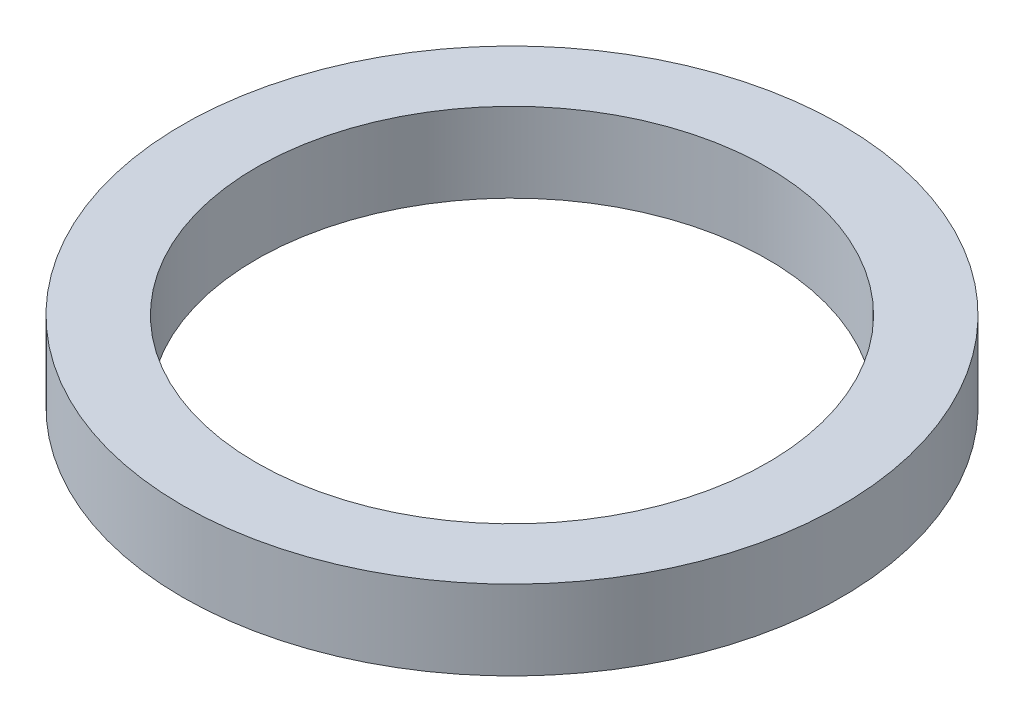
ISO-10303-21;
HEADER;
FILE_DESCRIPTION(('STEP AP214'),'2;1');
FILE_NAME('part.step','',(''),(''),'','','');
FILE_SCHEMA(('AUTOMOTIVE_DESIGN { 1 0 10303 214 1 1 1 1 }'));
ENDSEC;
DATA;
#1=APPLICATION_CONTEXT('core data for automotive mechanical design processes');
#2=APPLICATION_PROTOCOL_DEFINITION('international standard','automotive_design',2000,#1);
#3=PRODUCT_CONTEXT('',#1,'mechanical');
#4=PRODUCT('Part','Part','',(#3));
#5=PRODUCT_RELATED_PRODUCT_CATEGORY('part','',(#4));
#6=PRODUCT_DEFINITION_FORMATION('','',#4);
#7=PRODUCT_DEFINITION_CONTEXT('part definition',#1,'design');
#8=PRODUCT_DEFINITION('design','',#6,#7);
#9=PRODUCT_DEFINITION_SHAPE('','',#8);
#10=(LENGTH_UNIT() NAMED_UNIT(*) SI_UNIT(.MILLI.,.METRE.));
#11=(NAMED_UNIT(*) PLANE_ANGLE_UNIT() SI_UNIT($,.RADIAN.));
#12=(NAMED_UNIT(*) SI_UNIT($,.STERADIAN.) SOLID_ANGLE_UNIT());
#13=UNCERTAINTY_MEASURE_WITH_UNIT(LENGTH_MEASURE(1.E-05),#10,'distance_accuracy_value','');
#14=(GEOMETRIC_REPRESENTATION_CONTEXT(3) GLOBAL_UNCERTAINTY_ASSIGNED_CONTEXT((#13)) GLOBAL_UNIT_ASSIGNED_CONTEXT((#10,
#11,#12)) REPRESENTATION_CONTEXT('',''));
#15=CARTESIAN_POINT('',(0.,0.,0.));
#16=DIRECTION('',(0.,0.,1.));
#17=DIRECTION('',(1.,0.,0.));
#18=AXIS2_PLACEMENT_3D('',#15,#16,#17);
#19=CARTESIAN_POINT('',(0.,3.5,0.));
#20=DIRECTION('',(0.,1.,0.));
#21=DIRECTION('',(0.,0.,1.));
#22=AXIS2_PLACEMENT_3D('',#19,#20,#21);
#23=PLANE('',#22);
#24=CARTESIAN_POINT('',(0.,3.5,0.));
#25=DIRECTION('',(0.,1.,0.));
#26=DIRECTION('',(0.,0.,1.));
#27=AXIS2_PLACEMENT_3D('',#24,#25,#26);
#28=CIRCLE('',#27,29.);
#29=CARTESIAN_POINT('',(0.,3.5,29.));
#30=VERTEX_POINT('',#29);
#31=EDGE_CURVE('E10',#30,#30,#28,.T.);
#32=ORIENTED_EDGE('',*,*,#31,.T.);
#33=EDGE_LOOP('',(#32));
#34=FACE_BOUND('',#33,.T.);
#35=CARTESIAN_POINT('',(0.,3.5,0.));
#36=DIRECTION('',(0.,1.,0.));
#37=DIRECTION('',(0.,0.,1.));
#38=AXIS2_PLACEMENT_3D('',#35,#36,#37);
#39=CIRCLE('',#38,22.5);
#40=CARTESIAN_POINT('',(0.,3.5,22.5));
#41=VERTEX_POINT('',#40);
#42=EDGE_CURVE('E48',#41,#41,#39,.T.);
#43=ORIENTED_EDGE('',*,*,#42,.F.);
#44=EDGE_LOOP('',(#43));
#45=FACE_BOUND('',#44,.T.);
#46=ADVANCED_FACE('F37',(#34,#45),#23,.T.);
#47=CARTESIAN_POINT('',(0.,-3.5,0.));
#48=DIRECTION('',(0.,1.,0.));
#49=DIRECTION('',(0.,0.,1.));
#50=AXIS2_PLACEMENT_3D('',#47,#48,#49);
#51=PLANE('',#50);
#52=CARTESIAN_POINT('',(0.,-3.5,0.));
#53=DIRECTION('',(0.,1.,0.));
#54=DIRECTION('',(0.,0.,1.));
#55=AXIS2_PLACEMENT_3D('',#52,#53,#54);
#56=CIRCLE('',#55,29.);
#57=CARTESIAN_POINT('',(0.,-3.5,29.));
#58=VERTEX_POINT('',#57);
#59=EDGE_CURVE('E41',#58,#58,#56,.T.);
#60=ORIENTED_EDGE('',*,*,#59,.F.);
#61=EDGE_LOOP('',(#60));
#62=FACE_BOUND('',#61,.T.);
#63=CARTESIAN_POINT('',(0.,-3.5,0.));
#64=DIRECTION('',(0.,1.,0.));
#65=DIRECTION('',(0.,0.,1.));
#66=AXIS2_PLACEMENT_3D('',#63,#64,#65);
#67=CIRCLE('',#66,22.5);
#68=CARTESIAN_POINT('',(0.,-3.5,22.5));
#69=VERTEX_POINT('',#68);
#70=EDGE_CURVE('E50',#69,#69,#67,.T.);
#71=ORIENTED_EDGE('',*,*,#70,.T.);
#72=EDGE_LOOP('',(#71));
#73=FACE_BOUND('',#72,.T.);
#74=ADVANCED_FACE('F60',(#62,#73),#51,.F.);
#75=CARTESIAN_POINT('',(0.,3.5,0.));
#76=DIRECTION('',(0.,-1.,0.));
#77=DIRECTION('',(0.,0.,-1.));
#78=AXIS2_PLACEMENT_3D('',#75,#76,#77);
#79=CYLINDRICAL_SURFACE('',#78,29.);
#80=ORIENTED_EDGE('',*,*,#31,.F.);
#81=EDGE_LOOP('',(#80));
#82=FACE_BOUND('',#81,.T.);
#83=ORIENTED_EDGE('',*,*,#59,.T.);
#84=EDGE_LOOP('',(#83));
#85=FACE_BOUND('',#84,.T.);
#86=ADVANCED_FACE('F39',(#82,#85),#79,.T.);
#87=CARTESIAN_POINT('',(0.,3.5,0.));
#88=DIRECTION('',(0.,-1.,0.));
#89=DIRECTION('',(0.,0.,-1.));
#90=AXIS2_PLACEMENT_3D('',#87,#88,#89);
#91=CYLINDRICAL_SURFACE('',#90,22.5);
#92=ORIENTED_EDGE('',*,*,#42,.T.);
#93=EDGE_LOOP('',(#92));
#94=FACE_BOUND('',#93,.T.);
#95=ORIENTED_EDGE('',*,*,#70,.F.);
#96=EDGE_LOOP('',(#95));
#97=FACE_BOUND('',#96,.T.);
#98=ADVANCED_FACE('F56',(#94,#97),#91,.F.);
#99=CLOSED_SHELL('',(#46,#74,#86,#98));
#100=MANIFOLD_SOLID_BREP('B2',#99);
#101=ADVANCED_BREP_SHAPE_REPRESENTATION('',(#18,#100),#14);
#102=SHAPE_DEFINITION_REPRESENTATION(#9,#101);
ENDSEC;
END-ISO-10303-21;
